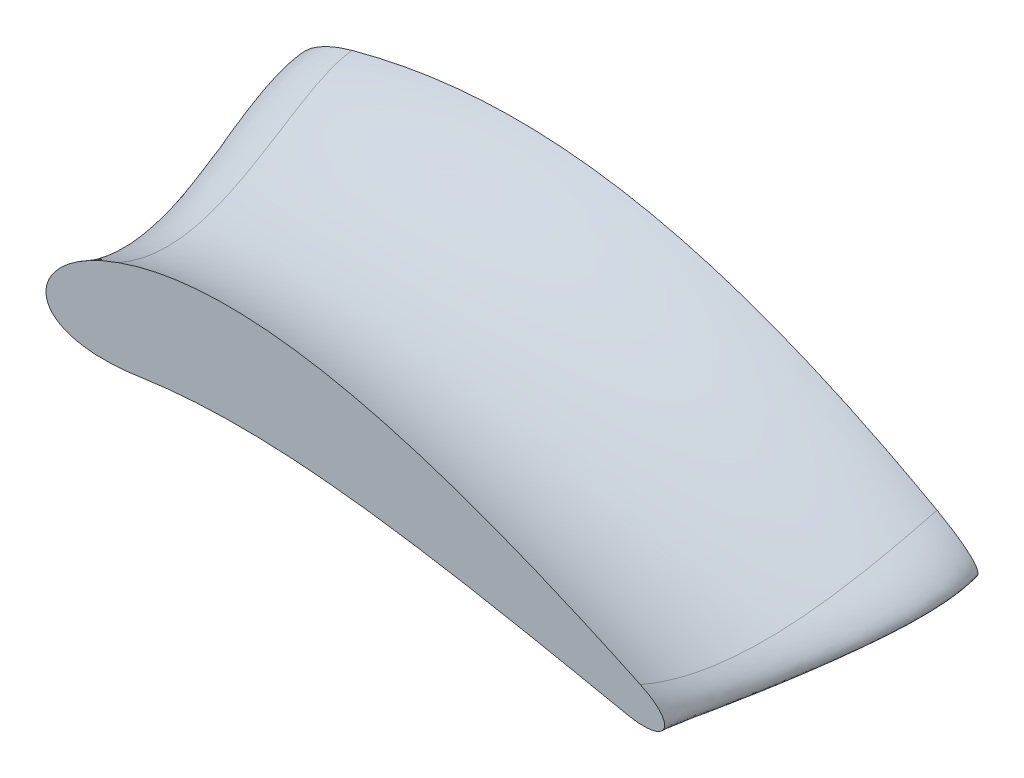
ISO-10303-21;
HEADER;
FILE_DESCRIPTION(('STEP AP214'),'2;1');
FILE_NAME('part.step','',(''),(''),'','','');
FILE_SCHEMA(('AUTOMOTIVE_DESIGN { 1 0 10303 214 1 1 1 1 }'));
ENDSEC;
DATA;
#1=APPLICATION_CONTEXT('core data for automotive mechanical design processes');
#2=APPLICATION_PROTOCOL_DEFINITION('international standard','automotive_design',2000,#1);
#3=PRODUCT_CONTEXT('',#1,'mechanical');
#4=PRODUCT('Part','Part','',(#3));
#5=PRODUCT_RELATED_PRODUCT_CATEGORY('part','',(#4));
#6=PRODUCT_DEFINITION_FORMATION('','',#4);
#7=PRODUCT_DEFINITION_CONTEXT('part definition',#1,'design');
#8=PRODUCT_DEFINITION('design','',#6,#7);
#9=PRODUCT_DEFINITION_SHAPE('','',#8);
#10=(LENGTH_UNIT() NAMED_UNIT(*) SI_UNIT(.MILLI.,.METRE.));
#11=(NAMED_UNIT(*) PLANE_ANGLE_UNIT() SI_UNIT($,.RADIAN.));
#12=(NAMED_UNIT(*) SI_UNIT($,.STERADIAN.) SOLID_ANGLE_UNIT());
#13=UNCERTAINTY_MEASURE_WITH_UNIT(LENGTH_MEASURE(1.E-05),#10,'distance_accuracy_value','');
#14=(GEOMETRIC_REPRESENTATION_CONTEXT(3) GLOBAL_UNCERTAINTY_ASSIGNED_CONTEXT((#13)) GLOBAL_UNIT_ASSIGNED_CONTEXT((#10,
#11,#12)) REPRESENTATION_CONTEXT('',''));
#15=CARTESIAN_POINT('',(0.,0.,0.));
#16=DIRECTION('',(0.,0.,1.));
#17=DIRECTION('',(1.,0.,0.));
#18=AXIS2_PLACEMENT_3D('',#15,#16,#17);
#19=CARTESIAN_POINT('',(-37.2906625279025,-7.56409985440655,0.));
#20=CARTESIAN_POINT('',(-37.0605857830419,-10.1165266421987,12.1898027714245));
#21=CARTESIAN_POINT('',(-14.9530821617464,-10.3206672426642,36.8398461886149));
#22=CARTESIAN_POINT('',(-24.41416606393,-5.97372874677151,50.));
#23=CARTESIAN_POINT('',(-7.79759687400787,-19.1624964598707,0.));
#24=CARTESIAN_POINT('',(-4.71761828298471,-14.9624495275191,13.2916091456367));
#25=CARTESIAN_POINT('',(1.53322102216059,-12.8478424875892,36.1798320919175));
#26=CARTESIAN_POINT('',(0.184907077913209,-2.24659645255293,50.));
#27=CARTESIAN_POINT('',(21.3069891772414,-2.85731555420632,0.));
#28=CARTESIAN_POINT('',(26.9153086351942,-5.749952084251,14.0929228723365));
#29=CARTESIAN_POINT('',(21.9654356950022,-10.6788547172574,35.6998218397739));
#30=CARTESIAN_POINT('',(26.9730030626108,-7.53259482170868,50.));
#31=CARTESIAN_POINT('',(62.0536017489672,-12.7205828830765,0.));
#32=CARTESIAN_POINT('',(69.6011534154616,-13.3950144633864,15.1947292465487));
#33=CARTESIAN_POINT('',(48.1323109681222,-19.3028194708405,35.0398077430765));
#34=CARTESIAN_POINT('',(60.3419786560461,-14.4365208065573,50.));
#35=B_SPLINE_SURFACE_WITH_KNOTS('',3,3,((#19,#20,#21,#22),(#23,#24,#25,#26),(#27,#28,#29,#30),
(#31,#32,#33,#34)),.UNSPECIFIED.,.F.,.F.,.F.,(4,4),(4,4),(0.,1.),(0.,1.),.UNSPECIFIED.);
#36=CARTESIAN_POINT('',(-37.2906625279025,-7.56409985440655,0.));
#37=CARTESIAN_POINT('',(-7.79759687400787,-19.1624964598707,0.));
#38=CARTESIAN_POINT('',(21.3069891772414,-2.85731555420632,0.));
#39=CARTESIAN_POINT('',(62.0536017489672,-12.7205828830765,0.));
#40=B_SPLINE_CURVE_WITH_KNOTS('',3,(#36,#37,#38,#39),.UNSPECIFIED.,.F.,.F.,(4,4),(0.,1.),.UNSPECIFIED.);
#41=CARTESIAN_POINT('',(-37.2906625279025,-7.56409985440655,0.));
#42=VERTEX_POINT('',#41);
#43=CARTESIAN_POINT('',(62.0536017489672,-12.7205828830765,0.));
#44=VERTEX_POINT('',#43);
#45=EDGE_CURVE('E737',#42,#44,#40,.T.);
#46=CARTESIAN_POINT('',(62.0536017489672,-12.7205828830765,0.));
#47=CARTESIAN_POINT('',(69.6011534154616,-13.3950144633864,15.1947292465486));
#48=CARTESIAN_POINT('',(48.1323109681222,-19.3028194708405,35.0398077430765));
#49=CARTESIAN_POINT('',(60.3419786560461,-14.4365208065573,50.));
#50=B_SPLINE_CURVE_WITH_KNOTS('',3,(#46,#47,#48,#49),.UNSPECIFIED.,.F.,.F.,(4,4),(0.,1.),.UNSPECIFIED.);
#51=CARTESIAN_POINT('',(60.3419786560461,-14.4365208065573,50.));
#52=VERTEX_POINT('',#51);
#53=EDGE_CURVE('E695',#44,#52,#50,.T.);
#54=CARTESIAN_POINT('',(-24.41416606393,-5.97372874677151,50.));
#55=CARTESIAN_POINT('',(0.184907077913209,-2.24659645255293,50.));
#56=CARTESIAN_POINT('',(26.9730030626108,-7.53259482170868,50.));
#57=CARTESIAN_POINT('',(60.3419786560461,-14.4365208065573,50.));
#58=B_SPLINE_CURVE_WITH_KNOTS('',3,(#54,#55,#56,#57),.UNSPECIFIED.,.F.,.F.,(4,4),(0.,1.),.UNSPECIFIED.);
#59=CARTESIAN_POINT('',(-24.41416606393,-5.97372874677151,50.));
#60=VERTEX_POINT('',#59);
#61=EDGE_CURVE('E642',#60,#52,#58,.T.);
#62=CARTESIAN_POINT('',(-24.41416606393,-5.97372874677151,50.));
#63=CARTESIAN_POINT('',(-14.9530821617464,-10.3206672426642,36.8398461886149));
#64=CARTESIAN_POINT('',(-37.0605857830419,-10.1165266421987,12.1898027714245));
#65=CARTESIAN_POINT('',(-37.2906625279025,-7.56409985440655,0.));
#66=B_SPLINE_CURVE_WITH_KNOTS('',3,(#62,#63,#64,#65),.UNSPECIFIED.,.F.,.F.,(4,4),(0.,1.),.UNSPECIFIED.);
#67=EDGE_CURVE('E683',#60,#42,#66,.T.);
#68=ORIENTED_EDGE('',*,*,#45,.T.);
#69=ORIENTED_EDGE('',*,*,#53,.T.);
#70=ORIENTED_EDGE('',*,*,#61,.F.);
#71=ORIENTED_EDGE('',*,*,#67,.T.);
#72=EDGE_LOOP('',(#68,#69,#70,#71));
#73=FACE_BOUND('',#72,.T.);
#74=ADVANCED_FACE('F637',(#73),#35,.T.);
#75=CARTESIAN_POINT('',(66.8976485502153,-13.3942511169068,50.));
#76=DIRECTION('',(0.,0.,1.));
#77=DIRECTION('',(0.,-1.,0.));
#78=AXIS2_PLACEMENT_3D('',#75,#76,#77);
#79=PLANE('',#78);
#80=CARTESIAN_POINT('',(62.7782369762875,-8.79465943336678,50.));
#81=CARTESIAN_POINT('',(69.574679850908,-11.9990659598038,50.));
#82=CARTESIAN_POINT('',(67.7789777388882,-15.9752102719729,50.));
#83=CARTESIAN_POINT('',(60.3419786560461,-14.4365208065573,50.));
#84=B_SPLINE_CURVE_WITH_KNOTS('',3,(#80,#81,#82,#83),.UNSPECIFIED.,.F.,.F.,(4,4),(0.,1.),.UNSPECIFIED.);
#85=CARTESIAN_POINT('',(62.7782369762875,-8.79465943336678,50.));
#86=VERTEX_POINT('',#85);
#87=EDGE_CURVE('E701',#86,#52,#84,.T.);
#88=ORIENTED_EDGE('',*,*,#87,.F.);
#89=CARTESIAN_POINT('',(-28.132665605351,9.41316590738451,50.));
#90=CARTESIAN_POINT('',(-3.84653455199565,17.9847415732746,50.));
#91=CARTESIAN_POINT('',(29.0552928592622,7.10513170926112,50.));
#92=CARTESIAN_POINT('',(62.7782369762875,-8.79465943336678,50.));
#93=B_SPLINE_CURVE_WITH_KNOTS('',3,(#89,#90,#91,#92),.UNSPECIFIED.,.F.,.F.,(4,4),(0.,1.),.UNSPECIFIED.);
#94=CARTESIAN_POINT('',(-28.132665605351,9.4131659073845,50.));
#95=VERTEX_POINT('',#94);
#96=EDGE_CURVE('E699',#95,#86,#93,.T.);
#97=ORIENTED_EDGE('',*,*,#96,.F.);
#98=CARTESIAN_POINT('',(-28.132665605351,9.4131659073845,50.));
#99=CARTESIAN_POINT('',(-45.5711462133945,3.2584080457221,50.));
#100=CARTESIAN_POINT('',(-45.5711462133945,-9.17933179972068,50.));
#101=CARTESIAN_POINT('',(-24.41416606393,-5.97372874677151,50.));
#102=B_SPLINE_CURVE_WITH_KNOTS('',3,(#98,#99,#100,#101),.UNSPECIFIED.,.F.,.F.,(4,4),(0.,1.),.UNSPECIFIED.);
#103=EDGE_CURVE('E686',#95,#60,#102,.T.);
#104=ORIENTED_EDGE('',*,*,#103,.T.);
#105=ORIENTED_EDGE('',*,*,#61,.T.);
#106=EDGE_LOOP('',(#88,#97,#104,#105));
#107=FACE_BOUND('',#106,.T.);
#108=ADVANCED_FACE('F698',(#107),#79,.T.);
#109=CARTESIAN_POINT('',(-28.132665605351,9.4131659073845,50.));
#110=CARTESIAN_POINT('',(-28.6464116656884,1.31084393234381,32.233924662529));
#111=CARTESIAN_POINT('',(-36.9919673147396,11.2487613814625,11.0454775795785));
#112=CARTESIAN_POINT('',(-37.4492645370117,11.7853452569097,0.));
#113=CARTESIAN_POINT('',(-45.5711462133945,3.2584080457221,50.));
#114=CARTESIAN_POINT('',(-40.6722947791027,-2.07315022305265,33.9227625554272));
#115=CARTESIAN_POINT('',(-52.7874181331005,5.30938099773809,11.4650634832554));
#116=CARTESIAN_POINT('',(-51.4062413386168,7.97889703829012,0.));
#117=CARTESIAN_POINT('',(-45.5711462133945,-9.17933179972068,50.));
#118=CARTESIAN_POINT('',(-37.6642612526044,-12.2252068964482,35.1510082957168));
#119=CARTESIAN_POINT('',(-53.1960891302363,-6.50435126370478,11.7702168677476));
#120=CARTESIAN_POINT('',(-51.4062413386168,-2.01302953558631,0.));
#121=CARTESIAN_POINT('',(-24.41416606393,-5.97372874677151,50.));
#122=CARTESIAN_POINT('',(-14.9530821617464,-10.3206672426642,36.8398461886149));
#123=CARTESIAN_POINT('',(-37.0605857830419,-10.1165266421987,12.1898027714245));
#124=CARTESIAN_POINT('',(-37.2906625279025,-7.56409985440655,0.));
#125=B_SPLINE_SURFACE_WITH_KNOTS('',3,3,((#109,#110,#111,#112),(#113,#114,#115,#116),(#117,#118,
#119,#120),(#121,#122,#123,#124)),.UNSPECIFIED.,.F.,.F.,.F.,(4,4),(4,4),(0.,1.),(0.,1.),.UNSPECIFIED.);
#126=CARTESIAN_POINT('',(-37.4492645370117,11.7853452569097,0.));
#127=CARTESIAN_POINT('',(-36.9919673147397,11.2487613814625,11.0454775795785));
#128=CARTESIAN_POINT('',(-28.6464116656884,1.31084393234381,32.233924662529));
#129=CARTESIAN_POINT('',(-28.132665605351,9.41316590738451,50.));
#130=B_SPLINE_CURVE_WITH_KNOTS('',3,(#126,#127,#128,#129),.UNSPECIFIED.,.F.,.F.,(4,4),(0.,1.),.UNSPECIFIED.);
#131=CARTESIAN_POINT('',(-37.4492645370117,11.7853452569097,0.));
#132=VERTEX_POINT('',#131);
#133=EDGE_CURVE('E759',#132,#95,#130,.T.);
#134=CARTESIAN_POINT('',(-37.4492645370117,11.7853452569097,0.));
#135=CARTESIAN_POINT('',(-51.4062413386168,7.97889703829012,0.));
#136=CARTESIAN_POINT('',(-51.4062413386168,-2.01302953558631,0.));
#137=CARTESIAN_POINT('',(-37.2906625279025,-7.56409985440655,0.));
#138=B_SPLINE_CURVE_WITH_KNOTS('',3,(#134,#135,#136,#137),.UNSPECIFIED.,.F.,.F.,(4,4),(0.,1.),.UNSPECIFIED.);
#139=EDGE_CURVE('E689',#132,#42,#138,.T.);
#140=ORIENTED_EDGE('',*,*,#103,.F.);
#141=ORIENTED_EDGE('',*,*,#133,.F.);
#142=ORIENTED_EDGE('',*,*,#139,.T.);
#143=ORIENTED_EDGE('',*,*,#67,.F.);
#144=EDGE_LOOP('',(#140,#141,#142,#143));
#145=FACE_BOUND('',#144,.T.);
#146=ADVANCED_FACE('F684',(#145),#125,.F.);
#147=CARTESIAN_POINT('',(64.4874090681752,-6.6388686246338,0.));
#148=CARTESIAN_POINT('',(66.306888388452,-7.37737605606685,12.2549477120043));
#149=CARTESIAN_POINT('',(63.4449980796427,-16.4388422931243,31.7762992754677));
#150=CARTESIAN_POINT('',(62.7782369762875,-8.79465943336678,50.));
#151=CARTESIAN_POINT('',(74.8963140852901,-12.4340968233518,0.));
#152=CARTESIAN_POINT('',(77.4918466704044,-12.2582776063317,13.3328676080039));
#153=CARTESIAN_POINT('',(66.8443236595699,-19.5155234509288,32.9729190469243));
#154=CARTESIAN_POINT('',(69.574679850908,-11.9990659598038,50.));
#155=CARTESIAN_POINT('',(73.770000026489,-15.5566951645401,0.));
#156=CARTESIAN_POINT('',(77.6478159378488,-15.7197637475826,14.116809350549));
#157=CARTESIAN_POINT('',(61.8601098359548,-22.3949239506093,33.84318797162));
#158=CARTESIAN_POINT('',(67.7789777388882,-15.9752102719729,50.));
#159=CARTESIAN_POINT('',(62.0536017489672,-12.7205828830765,0.));
#160=CARTESIAN_POINT('',(69.6011534154616,-13.3950144633864,15.1947292465486));
#161=CARTESIAN_POINT('',(48.1323109681222,-19.3028194708405,35.0398077430765));
#162=CARTESIAN_POINT('',(60.3419786560461,-14.4365208065573,50.));
#163=B_SPLINE_SURFACE_WITH_KNOTS('',3,3,((#147,#148,#149,#150),(#151,#152,#153,#154),(#155,#156,
#157,#158),(#159,#160,#161,#162)),.UNSPECIFIED.,.F.,.F.,.F.,(4,4),(4,4),(0.,1.),(0.,1.),.UNSPECIFIED.);
#164=CARTESIAN_POINT('',(64.4874090681752,-6.6388686246338,0.));
#165=CARTESIAN_POINT('',(74.8963140852901,-12.4340968233518,0.));
#166=CARTESIAN_POINT('',(73.770000026489,-15.5566951645401,0.));
#167=CARTESIAN_POINT('',(62.0536017489672,-12.7205828830765,0.));
#168=B_SPLINE_CURVE_WITH_KNOTS('',3,(#164,#165,#166,#167),.UNSPECIFIED.,.F.,.F.,(4,4),(0.,1.),.UNSPECIFIED.);
#169=CARTESIAN_POINT('',(64.4874090681752,-6.6388686246338,0.));
#170=VERTEX_POINT('',#169);
#171=EDGE_CURVE('E728',#170,#44,#168,.T.);
#172=CARTESIAN_POINT('',(64.4874090681752,-6.6388686246338,0.));
#173=CARTESIAN_POINT('',(66.306888388452,-7.37737605606685,12.2549477120043));
#174=CARTESIAN_POINT('',(63.4449980796427,-16.4388422931243,31.7762992754677));
#175=CARTESIAN_POINT('',(62.7782369762875,-8.79465943336678,50.));
#176=B_SPLINE_CURVE_WITH_KNOTS('',3,(#172,#173,#174,#175),.UNSPECIFIED.,.F.,.F.,(4,4),(0.,1.),.UNSPECIFIED.);
#177=EDGE_CURVE('E651',#170,#86,#176,.T.);
#178=ORIENTED_EDGE('',*,*,#171,.F.);
#179=ORIENTED_EDGE('',*,*,#177,.T.);
#180=ORIENTED_EDGE('',*,*,#87,.T.);
#181=ORIENTED_EDGE('',*,*,#53,.F.);
#182=EDGE_LOOP('',(#178,#179,#180,#181));
#183=FACE_BOUND('',#182,.T.);
#184=ADVANCED_FACE('F787',(#183),#163,.F.);
#185=CARTESIAN_POINT('',(-47.8971718870769,2.76485598882682,0.));
#186=DIRECTION('',(0.,0.,-1.));
#187=DIRECTION('',(0.,1.,0.));
#188=AXIS2_PLACEMENT_3D('',#185,#186,#187);
#189=PLANE('',#188);
#190=ORIENTED_EDGE('',*,*,#139,.F.);
#191=CARTESIAN_POINT('',(-37.4492645370117,11.7853452569097,0.));
#192=CARTESIAN_POINT('',(-5.56256582513605,20.4817176328758,0.));
#193=CARTESIAN_POINT('',(25.7430202552372,14.9323316333804,0.));
#194=CARTESIAN_POINT('',(64.4874090681752,-6.6388686246338,0.));
#195=B_SPLINE_CURVE_WITH_KNOTS('',3,(#191,#192,#193,#194),.UNSPECIFIED.,.F.,.F.,(4,4),(0.,1.),.UNSPECIFIED.);
#196=EDGE_CURVE('E12',#132,#170,#195,.T.);
#197=ORIENTED_EDGE('',*,*,#196,.T.);
#198=ORIENTED_EDGE('',*,*,#171,.T.);
#199=ORIENTED_EDGE('',*,*,#45,.F.);
#200=EDGE_LOOP('',(#190,#197,#198,#199));
#201=FACE_BOUND('',#200,.T.);
#202=ADVANCED_FACE('F789',(#201),#189,.T.);
#203=CARTESIAN_POINT('',(-37.4492645370117,11.7853452569097,0.));
#204=CARTESIAN_POINT('',(-36.9919673147397,11.2487613814625,11.0454775795785));
#205=CARTESIAN_POINT('',(-28.6464116656884,1.31084393234381,32.233924662529));
#206=CARTESIAN_POINT('',(-28.132665605351,9.41316590738451,50.));
#207=CARTESIAN_POINT('',(-5.56256582513605,20.4817176328758,0.));
#208=CARTESIAN_POINT('',(-5.9103229818871,19.7962440893883,11.488949961468));
#209=CARTESIAN_POINT('',(-2.62290683735429,10.1252549713499,32.0661286872732));
#210=CARTESIAN_POINT('',(-3.84653455199565,17.9847415732746,50.));
#211=CARTESIAN_POINT('',(25.7430202552372,14.9323316333804,0.));
#212=CARTESIAN_POINT('',(27.4218755349142,12.2174384006515,11.8114753301148));
#213=CARTESIAN_POINT('',(28.9303586072614,1.34338894572378,31.9440952507235));
#214=CARTESIAN_POINT('',(29.0552928592622,7.10513170926112,50.));
#215=CARTESIAN_POINT('',(64.4874090681752,-6.6388686246338,0.));
#216=CARTESIAN_POINT('',(66.306888388452,-7.37737605606685,12.2549477120043));
#217=CARTESIAN_POINT('',(63.4449980796427,-16.4388422931243,31.7762992754677));
#218=CARTESIAN_POINT('',(62.7782369762875,-8.79465943336678,50.));
#219=B_SPLINE_SURFACE_WITH_KNOTS('',3,3,((#203,#204,#205,#206),(#207,#208,#209,#210),(#211,#212,
#213,#214),(#215,#216,#217,#218)),.UNSPECIFIED.,.F.,.F.,.F.,(4,4),(4,4),(0.,1.),(0.,1.),.UNSPECIFIED.);
#220=ORIENTED_EDGE('',*,*,#196,.F.);
#221=ORIENTED_EDGE('',*,*,#133,.T.);
#222=ORIENTED_EDGE('',*,*,#96,.T.);
#223=ORIENTED_EDGE('',*,*,#177,.F.);
#224=EDGE_LOOP('',(#220,#221,#222,#223));
#225=FACE_BOUND('',#224,.T.);
#226=ADVANCED_FACE('F785',(#225),#219,.F.);
#227=CLOSED_SHELL('',(#74,#108,#146,#184,#202,#226));
#228=MANIFOLD_SOLID_BREP('B2',#227);
#229=ADVANCED_BREP_SHAPE_REPRESENTATION('',(#18,#228),#14);
#230=SHAPE_DEFINITION_REPRESENTATION(#9,#229);
ENDSEC;
END-ISO-10303-21;
